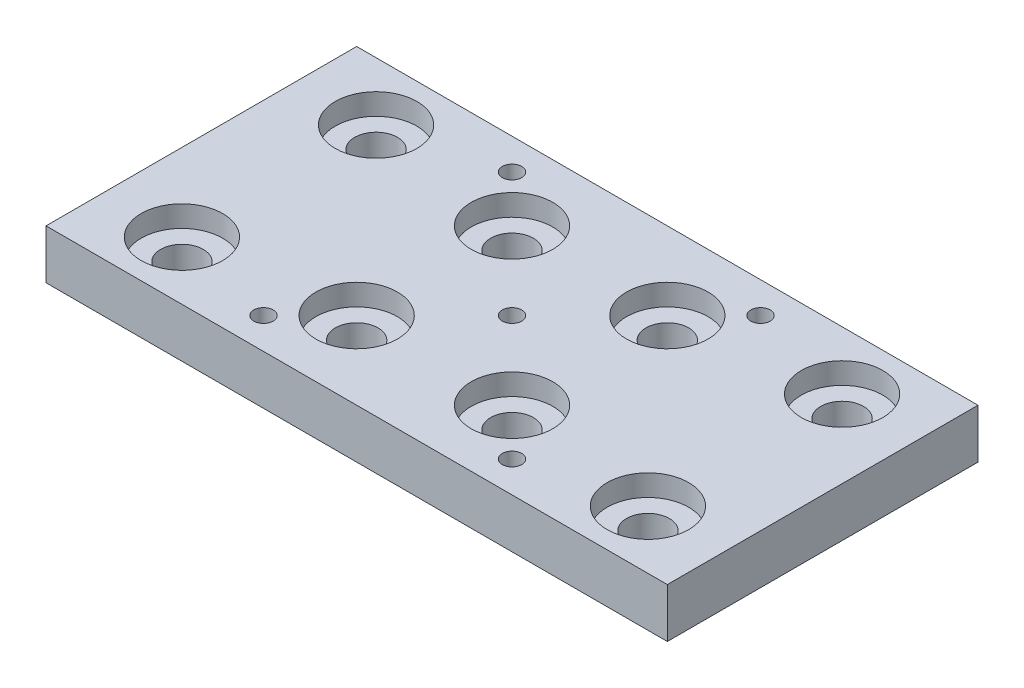
ISO-10303-21;
HEADER;
FILE_DESCRIPTION(('STEP AP214'),'2;1');
FILE_NAME('part.step','',(''),(''),'','','');
FILE_SCHEMA(('AUTOMOTIVE_DESIGN { 1 0 10303 214 1 1 1 1 }'));
ENDSEC;
DATA;
#1=APPLICATION_CONTEXT('core data for automotive mechanical design processes');
#2=APPLICATION_PROTOCOL_DEFINITION('international standard','automotive_design',2000,#1);
#3=PRODUCT_CONTEXT('',#1,'mechanical');
#4=PRODUCT('Part','Part','',(#3));
#5=PRODUCT_RELATED_PRODUCT_CATEGORY('part','',(#4));
#6=PRODUCT_DEFINITION_FORMATION('','',#4);
#7=PRODUCT_DEFINITION_CONTEXT('part definition',#1,'design');
#8=PRODUCT_DEFINITION('design','',#6,#7);
#9=PRODUCT_DEFINITION_SHAPE('','',#8);
#10=(LENGTH_UNIT() NAMED_UNIT(*) SI_UNIT(.MILLI.,.METRE.));
#11=(NAMED_UNIT(*) PLANE_ANGLE_UNIT() SI_UNIT($,.RADIAN.));
#12=(NAMED_UNIT(*) SI_UNIT($,.STERADIAN.) SOLID_ANGLE_UNIT());
#13=UNCERTAINTY_MEASURE_WITH_UNIT(LENGTH_MEASURE(1.E-05),#10,'distance_accuracy_value','');
#14=(GEOMETRIC_REPRESENTATION_CONTEXT(3) GLOBAL_UNCERTAINTY_ASSIGNED_CONTEXT((#13)) GLOBAL_UNIT_ASSIGNED_CONTEXT((#10,
#11,#12)) REPRESENTATION_CONTEXT('',''));
#15=CARTESIAN_POINT('',(0.,0.,0.));
#16=DIRECTION('',(0.,0.,1.));
#17=DIRECTION('',(1.,0.,0.));
#18=AXIS2_PLACEMENT_3D('',#15,#16,#17);
#19=CARTESIAN_POINT('',(0.,0.,0.));
#20=DIRECTION('',(0.,-1.,0.));
#21=DIRECTION('',(0.,0.,-1.));
#22=AXIS2_PLACEMENT_3D('',#19,#20,#21);
#23=PLANE('',#22);
#24=CARTESIAN_POINT('',(10.,0.,-10.));
#25=DIRECTION('',(0.,1.,0.));
#26=DIRECTION('',(0.,0.,1.));
#27=AXIS2_PLACEMENT_3D('',#24,#25,#26);
#28=CIRCLE('',#27,2.75);
#29=CARTESIAN_POINT('',(10.,0.,-7.25));
#30=VERTEX_POINT('',#29);
#31=EDGE_CURVE('E229',#30,#30,#28,.T.);
#32=ORIENTED_EDGE('',*,*,#31,.T.);
#33=EDGE_LOOP('',(#32));
#34=FACE_BOUND('',#33,.T.);
#35=CARTESIAN_POINT('',(30.,0.,-12.5));
#36=DIRECTION('',(0.,1.,0.));
#37=DIRECTION('',(0.,0.,1.));
#38=AXIS2_PLACEMENT_3D('',#35,#36,#37);
#39=CIRCLE('',#38,2.75);
#40=CARTESIAN_POINT('',(30.,0.,-9.75000000000001));
#41=VERTEX_POINT('',#40);
#42=EDGE_CURVE('E217',#41,#41,#39,.T.);
#43=ORIENTED_EDGE('',*,*,#42,.T.);
#44=EDGE_LOOP('',(#43));
#45=FACE_BOUND('',#44,.T.);
#46=CARTESIAN_POINT('',(-30.,0.,-12.5));
#47=DIRECTION('',(0.,1.,0.));
#48=DIRECTION('',(0.,0.,1.));
#49=AXIS2_PLACEMENT_3D('',#46,#47,#48);
#50=CIRCLE('',#49,2.75);
#51=CARTESIAN_POINT('',(-30.,0.,-9.74999999999998));
#52=VERTEX_POINT('',#51);
#53=EDGE_CURVE('E205',#52,#52,#50,.T.);
#54=ORIENTED_EDGE('',*,*,#53,.T.);
#55=EDGE_LOOP('',(#54));
#56=FACE_BOUND('',#55,.T.);
#57=CARTESIAN_POINT('',(-10.,0.,-10.));
#58=DIRECTION('',(0.,1.,0.));
#59=DIRECTION('',(0.,0.,1.));
#60=AXIS2_PLACEMENT_3D('',#57,#58,#59);
#61=CIRCLE('',#60,2.75);
#62=CARTESIAN_POINT('',(-10.,0.,-7.25));
#63=VERTEX_POINT('',#62);
#64=EDGE_CURVE('E193',#63,#63,#61,.T.);
#65=ORIENTED_EDGE('',*,*,#64,.T.);
#66=EDGE_LOOP('',(#65));
#67=FACE_BOUND('',#66,.T.);
#68=CARTESIAN_POINT('',(30.,0.,12.5));
#69=DIRECTION('',(0.,1.,0.));
#70=DIRECTION('',(0.,0.,1.));
#71=AXIS2_PLACEMENT_3D('',#68,#69,#70);
#72=CIRCLE('',#71,2.75);
#73=CARTESIAN_POINT('',(30.,0.,15.25));
#74=VERTEX_POINT('',#73);
#75=EDGE_CURVE('E181',#74,#74,#72,.T.);
#76=ORIENTED_EDGE('',*,*,#75,.T.);
#77=EDGE_LOOP('',(#76));
#78=FACE_BOUND('',#77,.T.);
#79=CARTESIAN_POINT('',(10.,0.,10.));
#80=DIRECTION('',(0.,1.,0.));
#81=DIRECTION('',(0.,0.,1.));
#82=AXIS2_PLACEMENT_3D('',#79,#80,#81);
#83=CIRCLE('',#82,2.75);
#84=CARTESIAN_POINT('',(10.,0.,12.75));
#85=VERTEX_POINT('',#84);
#86=EDGE_CURVE('E169',#85,#85,#83,.T.);
#87=ORIENTED_EDGE('',*,*,#86,.T.);
#88=EDGE_LOOP('',(#87));
#89=FACE_BOUND('',#88,.T.);
#90=CARTESIAN_POINT('',(-10.,0.,10.));
#91=DIRECTION('',(0.,1.,0.));
#92=DIRECTION('',(0.,0.,1.));
#93=AXIS2_PLACEMENT_3D('',#90,#91,#92);
#94=CIRCLE('',#93,2.75);
#95=CARTESIAN_POINT('',(-10.,0.,12.75));
#96=VERTEX_POINT('',#95);
#97=EDGE_CURVE('E157',#96,#96,#94,.T.);
#98=ORIENTED_EDGE('',*,*,#97,.T.);
#99=EDGE_LOOP('',(#98));
#100=FACE_BOUND('',#99,.T.);
#101=DIRECTION('',(0.,0.,-1.));
#102=VECTOR('',#101,1.);
#103=CARTESIAN_POINT('',(40.,0.,20.));
#104=LINE('',#103,#102);
#105=CARTESIAN_POINT('',(40.,0.,20.));
#106=VERTEX_POINT('',#105);
#107=CARTESIAN_POINT('',(40.,0.,-20.));
#108=VERTEX_POINT('',#107);
#109=EDGE_CURVE('E102',#106,#108,#104,.T.);
#110=ORIENTED_EDGE('',*,*,#109,.F.);
#111=DIRECTION('',(1.,0.,0.));
#112=VECTOR('',#111,1.);
#113=CARTESIAN_POINT('',(-40.,0.,20.));
#114=LINE('',#113,#112);
#115=CARTESIAN_POINT('',(-40.,0.,20.));
#116=VERTEX_POINT('',#115);
#117=EDGE_CURVE('E78',#116,#106,#114,.T.);
#118=ORIENTED_EDGE('',*,*,#117,.F.);
#119=DIRECTION('',(0.,0.,1.));
#120=VECTOR('',#119,1.);
#121=CARTESIAN_POINT('',(-40.,0.,20.));
#122=LINE('',#121,#120);
#123=CARTESIAN_POINT('',(-40.,0.,-20.));
#124=VERTEX_POINT('',#123);
#125=EDGE_CURVE('E72',#124,#116,#122,.T.);
#126=ORIENTED_EDGE('',*,*,#125,.F.);
#127=DIRECTION('',(-1.,0.,0.));
#128=VECTOR('',#127,1.);
#129=CARTESIAN_POINT('',(-40.,0.,-20.));
#130=LINE('',#129,#128);
#131=EDGE_CURVE('E94',#108,#124,#130,.T.);
#132=ORIENTED_EDGE('',*,*,#131,.F.);
#133=EDGE_LOOP('',(#110,#118,#126,#132));
#134=FACE_BOUND('',#133,.T.);
#135=CARTESIAN_POINT('',(16.,0.,16.));
#136=DIRECTION('',(0.,1.,0.));
#137=DIRECTION('',(0.,0.,1.));
#138=AXIS2_PLACEMENT_3D('',#135,#136,#137);
#139=CIRCLE('',#138,1.25);
#140=CARTESIAN_POINT('',(16.,0.,17.25));
#141=VERTEX_POINT('',#140);
#142=EDGE_CURVE('E105',#141,#141,#139,.T.);
#143=ORIENTED_EDGE('',*,*,#142,.T.);
#144=EDGE_LOOP('',(#143));
#145=FACE_BOUND('',#144,.T.);
#146=CARTESIAN_POINT('',(-16.,0.,-16.));
#147=DIRECTION('',(0.,1.,0.));
#148=DIRECTION('',(0.,0.,1.));
#149=AXIS2_PLACEMENT_3D('',#146,#147,#148);
#150=CIRCLE('',#149,1.25);
#151=CARTESIAN_POINT('',(-16.,0.,-14.75));
#152=VERTEX_POINT('',#151);
#153=EDGE_CURVE('E121',#152,#152,#150,.T.);
#154=ORIENTED_EDGE('',*,*,#153,.T.);
#155=EDGE_LOOP('',(#154));
#156=FACE_BOUND('',#155,.T.);
#157=CARTESIAN_POINT('',(-16.,0.,16.));
#158=DIRECTION('',(0.,1.,0.));
#159=DIRECTION('',(0.,0.,1.));
#160=AXIS2_PLACEMENT_3D('',#157,#158,#159);
#161=CIRCLE('',#160,1.25);
#162=CARTESIAN_POINT('',(-16.,0.,17.25));
#163=VERTEX_POINT('',#162);
#164=EDGE_CURVE('E127',#163,#163,#161,.T.);
#165=ORIENTED_EDGE('',*,*,#164,.T.);
#166=EDGE_LOOP('',(#165));
#167=FACE_BOUND('',#166,.T.);
#168=CARTESIAN_POINT('',(16.,0.,-16.));
#169=DIRECTION('',(0.,1.,0.));
#170=DIRECTION('',(0.,0.,1.));
#171=AXIS2_PLACEMENT_3D('',#168,#169,#170);
#172=CIRCLE('',#171,1.25);
#173=CARTESIAN_POINT('',(16.,0.,-14.75));
#174=VERTEX_POINT('',#173);
#175=EDGE_CURVE('E133',#174,#174,#172,.T.);
#176=ORIENTED_EDGE('',*,*,#175,.T.);
#177=EDGE_LOOP('',(#176));
#178=FACE_BOUND('',#177,.T.);
#179=CARTESIAN_POINT('',(0.,0.,0.));
#180=DIRECTION('',(0.,1.,0.));
#181=DIRECTION('',(0.,0.,1.));
#182=AXIS2_PLACEMENT_3D('',#179,#180,#181);
#183=CIRCLE('',#182,1.25);
#184=CARTESIAN_POINT('',(0.,0.,1.25));
#185=VERTEX_POINT('',#184);
#186=EDGE_CURVE('E139',#185,#185,#183,.T.);
#187=ORIENTED_EDGE('',*,*,#186,.T.);
#188=EDGE_LOOP('',(#187));
#189=FACE_BOUND('',#188,.T.);
#190=CARTESIAN_POINT('',(-30.,0.,12.5));
#191=DIRECTION('',(0.,1.,0.));
#192=DIRECTION('',(0.,0.,1.));
#193=AXIS2_PLACEMENT_3D('',#190,#191,#192);
#194=CIRCLE('',#193,2.75);
#195=CARTESIAN_POINT('',(-30.,0.,15.25));
#196=VERTEX_POINT('',#195);
#197=EDGE_CURVE('E145',#196,#196,#194,.T.);
#198=ORIENTED_EDGE('',*,*,#197,.T.);
#199=EDGE_LOOP('',(#198));
#200=FACE_BOUND('',#199,.T.);
#201=ADVANCED_FACE('F38',(#34,#45,#56,#67,#78,#89,#100,#134,#145,#156,#167,#178,#189,#200),#23,.T.);
#202=CARTESIAN_POINT('',(40.,6.35,20.));
#203=DIRECTION('',(-1.,0.,0.));
#204=DIRECTION('',(0.,0.,1.));
#205=AXIS2_PLACEMENT_3D('',#202,#203,#204);
#206=PLANE('',#205);
#207=ORIENTED_EDGE('',*,*,#109,.T.);
#208=DIRECTION('',(0.,-1.,0.));
#209=VECTOR('',#208,1.);
#210=CARTESIAN_POINT('',(40.,6.35,-20.));
#211=LINE('',#210,#209);
#212=CARTESIAN_POINT('',(40.,6.35,-20.));
#213=VERTEX_POINT('',#212);
#214=EDGE_CURVE('E11',#213,#108,#211,.T.);
#215=ORIENTED_EDGE('',*,*,#214,.F.);
#216=DIRECTION('',(0.,0.,-1.));
#217=VECTOR('',#216,1.);
#218=CARTESIAN_POINT('',(40.,6.35,20.));
#219=LINE('',#218,#217);
#220=CARTESIAN_POINT('',(40.,6.35,20.));
#221=VERTEX_POINT('',#220);
#222=EDGE_CURVE('E90',#221,#213,#219,.T.);
#223=ORIENTED_EDGE('',*,*,#222,.F.);
#224=DIRECTION('',(0.,-1.,0.));
#225=VECTOR('',#224,1.);
#226=CARTESIAN_POINT('',(40.,6.35,20.));
#227=LINE('',#226,#225);
#228=EDGE_CURVE('E98',#221,#106,#227,.T.);
#229=ORIENTED_EDGE('',*,*,#228,.T.);
#230=EDGE_LOOP('',(#207,#215,#223,#229));
#231=FACE_BOUND('',#230,.T.);
#232=ADVANCED_FACE('F40',(#231),#206,.F.);
#233=CARTESIAN_POINT('',(-40.,6.35,-20.));
#234=DIRECTION('',(0.,0.,1.));
#235=DIRECTION('',(1.,0.,0.));
#236=AXIS2_PLACEMENT_3D('',#233,#234,#235);
#237=PLANE('',#236);
#238=ORIENTED_EDGE('',*,*,#131,.T.);
#239=DIRECTION('',(0.,-1.,0.));
#240=VECTOR('',#239,1.);
#241=CARTESIAN_POINT('',(-40.,6.35,-20.));
#242=LINE('',#241,#240);
#243=CARTESIAN_POINT('',(-40.,6.35,-20.));
#244=VERTEX_POINT('',#243);
#245=EDGE_CURVE('E47',#244,#124,#242,.T.);
#246=ORIENTED_EDGE('',*,*,#245,.F.);
#247=DIRECTION('',(-1.,0.,0.));
#248=VECTOR('',#247,1.);
#249=CARTESIAN_POINT('',(-40.,6.35,-20.));
#250=LINE('',#249,#248);
#251=EDGE_CURVE('E85',#213,#244,#250,.T.);
#252=ORIENTED_EDGE('',*,*,#251,.F.);
#253=ORIENTED_EDGE('',*,*,#214,.T.);
#254=EDGE_LOOP('',(#238,#246,#252,#253));
#255=FACE_BOUND('',#254,.T.);
#256=ADVANCED_FACE('F93',(#255),#237,.F.);
#257=CARTESIAN_POINT('',(-40.,6.35,20.));
#258=DIRECTION('',(1.,0.,0.));
#259=DIRECTION('',(0.,0.,-1.));
#260=AXIS2_PLACEMENT_3D('',#257,#258,#259);
#261=PLANE('',#260);
#262=ORIENTED_EDGE('',*,*,#125,.T.);
#263=DIRECTION('',(0.,-1.,0.));
#264=VECTOR('',#263,1.);
#265=CARTESIAN_POINT('',(-40.,6.35,20.));
#266=LINE('',#265,#264);
#267=CARTESIAN_POINT('',(-40.,6.35,20.));
#268=VERTEX_POINT('',#267);
#269=EDGE_CURVE('E95',#268,#116,#266,.T.);
#270=ORIENTED_EDGE('',*,*,#269,.F.);
#271=DIRECTION('',(0.,0.,1.));
#272=VECTOR('',#271,1.);
#273=CARTESIAN_POINT('',(-40.,6.35,20.));
#274=LINE('',#273,#272);
#275=EDGE_CURVE('E88',#244,#268,#274,.T.);
#276=ORIENTED_EDGE('',*,*,#275,.F.);
#277=ORIENTED_EDGE('',*,*,#245,.T.);
#278=EDGE_LOOP('',(#262,#270,#276,#277));
#279=FACE_BOUND('',#278,.T.);
#280=ADVANCED_FACE('F96',(#279),#261,.F.);
#281=CARTESIAN_POINT('',(-40.,6.35,20.));
#282=DIRECTION('',(0.,0.,-1.));
#283=DIRECTION('',(-1.,0.,0.));
#284=AXIS2_PLACEMENT_3D('',#281,#282,#283);
#285=PLANE('',#284);
#286=ORIENTED_EDGE('',*,*,#117,.T.);
#287=ORIENTED_EDGE('',*,*,#228,.F.);
#288=DIRECTION('',(1.,0.,0.));
#289=VECTOR('',#288,1.);
#290=CARTESIAN_POINT('',(-40.,6.35,20.));
#291=LINE('',#290,#289);
#292=EDGE_CURVE('E55',#268,#221,#291,.T.);
#293=ORIENTED_EDGE('',*,*,#292,.F.);
#294=ORIENTED_EDGE('',*,*,#269,.T.);
#295=EDGE_LOOP('',(#286,#287,#293,#294));
#296=FACE_BOUND('',#295,.T.);
#297=ADVANCED_FACE('F110',(#296),#285,.F.);
#298=CARTESIAN_POINT('',(0.,6.35,0.));
#299=DIRECTION('',(0.,-1.,0.));
#300=DIRECTION('',(0.,0.,-1.));
#301=AXIS2_PLACEMENT_3D('',#298,#299,#300);
#302=PLANE('',#301);
#303=CARTESIAN_POINT('',(10.,6.35,-10.));
#304=DIRECTION('',(0.,1.,0.));
#305=DIRECTION('',(0.,0.,1.));
#306=AXIS2_PLACEMENT_3D('',#303,#304,#305);
#307=CIRCLE('',#306,5.25);
#308=CARTESIAN_POINT('',(10.,6.35,-4.75));
#309=VERTEX_POINT('',#308);
#310=EDGE_CURVE('E238',#309,#309,#307,.T.);
#311=ORIENTED_EDGE('',*,*,#310,.F.);
#312=EDGE_LOOP('',(#311));
#313=FACE_BOUND('',#312,.T.);
#314=CARTESIAN_POINT('',(30.,6.35,-12.5));
#315=DIRECTION('',(0.,1.,0.));
#316=DIRECTION('',(0.,0.,1.));
#317=AXIS2_PLACEMENT_3D('',#314,#315,#316);
#318=CIRCLE('',#317,5.25);
#319=CARTESIAN_POINT('',(30.,6.35,-7.25));
#320=VERTEX_POINT('',#319);
#321=EDGE_CURVE('E226',#320,#320,#318,.T.);
#322=ORIENTED_EDGE('',*,*,#321,.F.);
#323=EDGE_LOOP('',(#322));
#324=FACE_BOUND('',#323,.T.);
#325=CARTESIAN_POINT('',(-30.,6.35,-12.5));
#326=DIRECTION('',(0.,1.,0.));
#327=DIRECTION('',(0.,0.,1.));
#328=AXIS2_PLACEMENT_3D('',#325,#326,#327);
#329=CIRCLE('',#328,5.25);
#330=CARTESIAN_POINT('',(-30.,6.35,-7.24999999999998));
#331=VERTEX_POINT('',#330);
#332=EDGE_CURVE('E214',#331,#331,#329,.T.);
#333=ORIENTED_EDGE('',*,*,#332,.F.);
#334=EDGE_LOOP('',(#333));
#335=FACE_BOUND('',#334,.T.);
#336=CARTESIAN_POINT('',(-10.,6.35,-10.));
#337=DIRECTION('',(0.,1.,0.));
#338=DIRECTION('',(0.,0.,1.));
#339=AXIS2_PLACEMENT_3D('',#336,#337,#338);
#340=CIRCLE('',#339,5.25);
#341=CARTESIAN_POINT('',(-10.,6.35,-4.75));
#342=VERTEX_POINT('',#341);
#343=EDGE_CURVE('E202',#342,#342,#340,.T.);
#344=ORIENTED_EDGE('',*,*,#343,.F.);
#345=EDGE_LOOP('',(#344));
#346=FACE_BOUND('',#345,.T.);
#347=CARTESIAN_POINT('',(30.,6.35,12.5));
#348=DIRECTION('',(0.,1.,0.));
#349=DIRECTION('',(0.,0.,1.));
#350=AXIS2_PLACEMENT_3D('',#347,#348,#349);
#351=CIRCLE('',#350,5.25);
#352=CARTESIAN_POINT('',(30.,6.35,17.75));
#353=VERTEX_POINT('',#352);
#354=EDGE_CURVE('E190',#353,#353,#351,.T.);
#355=ORIENTED_EDGE('',*,*,#354,.F.);
#356=EDGE_LOOP('',(#355));
#357=FACE_BOUND('',#356,.T.);
#358=CARTESIAN_POINT('',(10.,6.35,10.));
#359=DIRECTION('',(0.,1.,0.));
#360=DIRECTION('',(0.,0.,1.));
#361=AXIS2_PLACEMENT_3D('',#358,#359,#360);
#362=CIRCLE('',#361,5.25);
#363=CARTESIAN_POINT('',(10.,6.35,15.25));
#364=VERTEX_POINT('',#363);
#365=EDGE_CURVE('E178',#364,#364,#362,.T.);
#366=ORIENTED_EDGE('',*,*,#365,.F.);
#367=EDGE_LOOP('',(#366));
#368=FACE_BOUND('',#367,.T.);
#369=CARTESIAN_POINT('',(-10.,6.35,10.));
#370=DIRECTION('',(0.,1.,0.));
#371=DIRECTION('',(0.,0.,1.));
#372=AXIS2_PLACEMENT_3D('',#369,#370,#371);
#373=CIRCLE('',#372,5.25);
#374=CARTESIAN_POINT('',(-10.,6.35,15.25));
#375=VERTEX_POINT('',#374);
#376=EDGE_CURVE('E166',#375,#375,#373,.T.);
#377=ORIENTED_EDGE('',*,*,#376,.F.);
#378=EDGE_LOOP('',(#377));
#379=FACE_BOUND('',#378,.T.);
#380=CARTESIAN_POINT('',(-30.,6.35,12.5));
#381=DIRECTION('',(0.,1.,0.));
#382=DIRECTION('',(0.,0.,1.));
#383=AXIS2_PLACEMENT_3D('',#380,#381,#382);
#384=CIRCLE('',#383,5.25);
#385=CARTESIAN_POINT('',(-30.,6.35,17.75));
#386=VERTEX_POINT('',#385);
#387=EDGE_CURVE('E154',#386,#386,#384,.T.);
#388=ORIENTED_EDGE('',*,*,#387,.F.);
#389=EDGE_LOOP('',(#388));
#390=FACE_BOUND('',#389,.T.);
#391=CARTESIAN_POINT('',(0.,6.35,0.));
#392=DIRECTION('',(0.,1.,0.));
#393=DIRECTION('',(0.,0.,1.));
#394=AXIS2_PLACEMENT_3D('',#391,#392,#393);
#395=CIRCLE('',#394,1.25);
#396=CARTESIAN_POINT('',(0.,6.35,1.25));
#397=VERTEX_POINT('',#396);
#398=EDGE_CURVE('E142',#397,#397,#395,.T.);
#399=ORIENTED_EDGE('',*,*,#398,.F.);
#400=EDGE_LOOP('',(#399));
#401=FACE_BOUND('',#400,.T.);
#402=CARTESIAN_POINT('',(16.,6.35,-16.));
#403=DIRECTION('',(0.,1.,0.));
#404=DIRECTION('',(0.,0.,1.));
#405=AXIS2_PLACEMENT_3D('',#402,#403,#404);
#406=CIRCLE('',#405,1.25);
#407=CARTESIAN_POINT('',(16.,6.35,-14.75));
#408=VERTEX_POINT('',#407);
#409=EDGE_CURVE('E136',#408,#408,#406,.T.);
#410=ORIENTED_EDGE('',*,*,#409,.F.);
#411=EDGE_LOOP('',(#410));
#412=FACE_BOUND('',#411,.T.);
#413=CARTESIAN_POINT('',(-16.,6.35,16.));
#414=DIRECTION('',(0.,1.,0.));
#415=DIRECTION('',(0.,0.,1.));
#416=AXIS2_PLACEMENT_3D('',#413,#414,#415);
#417=CIRCLE('',#416,1.25);
#418=CARTESIAN_POINT('',(-16.,6.35,17.25));
#419=VERTEX_POINT('',#418);
#420=EDGE_CURVE('E130',#419,#419,#417,.T.);
#421=ORIENTED_EDGE('',*,*,#420,.F.);
#422=EDGE_LOOP('',(#421));
#423=FACE_BOUND('',#422,.T.);
#424=CARTESIAN_POINT('',(-16.,6.35,-16.));
#425=DIRECTION('',(0.,1.,0.));
#426=DIRECTION('',(0.,0.,1.));
#427=AXIS2_PLACEMENT_3D('',#424,#425,#426);
#428=CIRCLE('',#427,1.25);
#429=CARTESIAN_POINT('',(-16.,6.35,-14.75));
#430=VERTEX_POINT('',#429);
#431=EDGE_CURVE('E124',#430,#430,#428,.T.);
#432=ORIENTED_EDGE('',*,*,#431,.F.);
#433=EDGE_LOOP('',(#432));
#434=FACE_BOUND('',#433,.T.);
#435=CARTESIAN_POINT('',(16.,6.35,16.));
#436=DIRECTION('',(0.,1.,0.));
#437=DIRECTION('',(0.,0.,1.));
#438=AXIS2_PLACEMENT_3D('',#435,#436,#437);
#439=CIRCLE('',#438,1.25);
#440=CARTESIAN_POINT('',(16.,6.35,17.25));
#441=VERTEX_POINT('',#440);
#442=EDGE_CURVE('E118',#441,#441,#439,.T.);
#443=ORIENTED_EDGE('',*,*,#442,.F.);
#444=EDGE_LOOP('',(#443));
#445=FACE_BOUND('',#444,.T.);
#446=ORIENTED_EDGE('',*,*,#222,.T.);
#447=ORIENTED_EDGE('',*,*,#251,.T.);
#448=ORIENTED_EDGE('',*,*,#275,.T.);
#449=ORIENTED_EDGE('',*,*,#292,.T.);
#450=EDGE_LOOP('',(#446,#447,#448,#449));
#451=FACE_BOUND('',#450,.T.);
#452=ADVANCED_FACE('F86',(#313,#324,#335,#346,#357,#368,#379,#390,#401,#412,#423,#434,#445,
#451),#302,.F.);
#453=CARTESIAN_POINT('',(16.,6.35,16.));
#454=DIRECTION('',(0.,1.,0.));
#455=DIRECTION('',(0.,0.,1.));
#456=AXIS2_PLACEMENT_3D('',#453,#454,#455);
#457=CYLINDRICAL_SURFACE('',#456,1.25);
#458=ORIENTED_EDGE('',*,*,#142,.F.);
#459=EDGE_LOOP('',(#458));
#460=FACE_BOUND('',#459,.T.);
#461=ORIENTED_EDGE('',*,*,#442,.T.);
#462=EDGE_LOOP('',(#461));
#463=FACE_BOUND('',#462,.T.);
#464=ADVANCED_FACE('F246',(#460,#463),#457,.F.);
#465=CARTESIAN_POINT('',(-16.,6.35,-16.));
#466=DIRECTION('',(0.,1.,0.));
#467=DIRECTION('',(0.,0.,1.));
#468=AXIS2_PLACEMENT_3D('',#465,#466,#467);
#469=CYLINDRICAL_SURFACE('',#468,1.25);
#470=ORIENTED_EDGE('',*,*,#153,.F.);
#471=EDGE_LOOP('',(#470));
#472=FACE_BOUND('',#471,.T.);
#473=ORIENTED_EDGE('',*,*,#431,.T.);
#474=EDGE_LOOP('',(#473));
#475=FACE_BOUND('',#474,.T.);
#476=ADVANCED_FACE('F273',(#472,#475),#469,.F.);
#477=CARTESIAN_POINT('',(-16.,6.35,16.));
#478=DIRECTION('',(0.,1.,0.));
#479=DIRECTION('',(0.,0.,1.));
#480=AXIS2_PLACEMENT_3D('',#477,#478,#479);
#481=CYLINDRICAL_SURFACE('',#480,1.25);
#482=ORIENTED_EDGE('',*,*,#164,.F.);
#483=EDGE_LOOP('',(#482));
#484=FACE_BOUND('',#483,.T.);
#485=ORIENTED_EDGE('',*,*,#420,.T.);
#486=EDGE_LOOP('',(#485));
#487=FACE_BOUND('',#486,.T.);
#488=ADVANCED_FACE('F279',(#484,#487),#481,.F.);
#489=CARTESIAN_POINT('',(16.,6.35,-16.));
#490=DIRECTION('',(0.,1.,0.));
#491=DIRECTION('',(0.,0.,1.));
#492=AXIS2_PLACEMENT_3D('',#489,#490,#491);
#493=CYLINDRICAL_SURFACE('',#492,1.25);
#494=ORIENTED_EDGE('',*,*,#175,.F.);
#495=EDGE_LOOP('',(#494));
#496=FACE_BOUND('',#495,.T.);
#497=ORIENTED_EDGE('',*,*,#409,.T.);
#498=EDGE_LOOP('',(#497));
#499=FACE_BOUND('',#498,.T.);
#500=ADVANCED_FACE('F564',(#496,#499),#493,.F.);
#501=CARTESIAN_POINT('',(0.,6.35,0.));
#502=DIRECTION('',(0.,1.,0.));
#503=DIRECTION('',(0.,0.,1.));
#504=AXIS2_PLACEMENT_3D('',#501,#502,#503);
#505=CYLINDRICAL_SURFACE('',#504,1.25);
#506=ORIENTED_EDGE('',*,*,#186,.F.);
#507=EDGE_LOOP('',(#506));
#508=FACE_BOUND('',#507,.T.);
#509=ORIENTED_EDGE('',*,*,#398,.T.);
#510=EDGE_LOOP('',(#509));
#511=FACE_BOUND('',#510,.T.);
#512=ADVANCED_FACE('F327',(#508,#511),#505,.F.);
#513=CARTESIAN_POINT('',(-30.,6.35,12.5));
#514=DIRECTION('',(0.,1.,0.));
#515=DIRECTION('',(0.,0.,1.));
#516=AXIS2_PLACEMENT_3D('',#513,#514,#515);
#517=CYLINDRICAL_SURFACE('',#516,2.75);
#518=ORIENTED_EDGE('',*,*,#197,.F.);
#519=EDGE_LOOP('',(#518));
#520=FACE_BOUND('',#519,.T.);
#521=CARTESIAN_POINT('',(-30.,3.6,12.5));
#522=DIRECTION('',(0.,1.,0.));
#523=DIRECTION('',(0.,0.,1.));
#524=AXIS2_PLACEMENT_3D('',#521,#522,#523);
#525=CIRCLE('',#524,2.75);
#526=CARTESIAN_POINT('',(-30.,3.6,15.25));
#527=VERTEX_POINT('',#526);
#528=EDGE_CURVE('E148',#527,#527,#525,.T.);
#529=ORIENTED_EDGE('',*,*,#528,.T.);
#530=EDGE_LOOP('',(#529));
#531=FACE_BOUND('',#530,.T.);
#532=ADVANCED_FACE('F321',(#520,#531),#517,.F.);
#533=CARTESIAN_POINT('',(-27.25,3.6,12.5));
#534=DIRECTION('',(0.,-1.,0.));
#535=DIRECTION('',(0.,0.,-1.));
#536=AXIS2_PLACEMENT_3D('',#533,#534,#535);
#537=PLANE('',#536);
#538=ORIENTED_EDGE('',*,*,#528,.F.);
#539=EDGE_LOOP('',(#538));
#540=FACE_BOUND('',#539,.T.);
#541=CARTESIAN_POINT('',(-30.,3.6,12.5));
#542=DIRECTION('',(0.,1.,0.));
#543=DIRECTION('',(0.,0.,1.));
#544=AXIS2_PLACEMENT_3D('',#541,#542,#543);
#545=CIRCLE('',#544,5.25);
#546=CARTESIAN_POINT('',(-30.,3.6,17.75));
#547=VERTEX_POINT('',#546);
#548=EDGE_CURVE('E151',#547,#547,#545,.T.);
#549=ORIENTED_EDGE('',*,*,#548,.T.);
#550=EDGE_LOOP('',(#549));
#551=FACE_BOUND('',#550,.T.);
#552=ADVANCED_FACE('F326',(#540,#551),#537,.F.);
#553=CARTESIAN_POINT('',(-30.,6.35,12.5));
#554=DIRECTION('',(0.,1.,0.));
#555=DIRECTION('',(0.,0.,1.));
#556=AXIS2_PLACEMENT_3D('',#553,#554,#555);
#557=CYLINDRICAL_SURFACE('',#556,5.25);
#558=ORIENTED_EDGE('',*,*,#548,.F.);
#559=EDGE_LOOP('',(#558));
#560=FACE_BOUND('',#559,.T.);
#561=ORIENTED_EDGE('',*,*,#387,.T.);
#562=EDGE_LOOP('',(#561));
#563=FACE_BOUND('',#562,.T.);
#564=ADVANCED_FACE('F338',(#560,#563),#557,.F.);
#565=CARTESIAN_POINT('',(-10.,6.35,10.));
#566=DIRECTION('',(0.,1.,0.));
#567=DIRECTION('',(0.,0.,1.));
#568=AXIS2_PLACEMENT_3D('',#565,#566,#567);
#569=CYLINDRICAL_SURFACE('',#568,2.75);
#570=ORIENTED_EDGE('',*,*,#97,.F.);
#571=EDGE_LOOP('',(#570));
#572=FACE_BOUND('',#571,.T.);
#573=CARTESIAN_POINT('',(-10.,3.6,10.));
#574=DIRECTION('',(0.,1.,0.));
#575=DIRECTION('',(0.,0.,1.));
#576=AXIS2_PLACEMENT_3D('',#573,#574,#575);
#577=CIRCLE('',#576,2.75);
#578=CARTESIAN_POINT('',(-10.,3.6,12.75));
#579=VERTEX_POINT('',#578);
#580=EDGE_CURVE('E160',#579,#579,#577,.T.);
#581=ORIENTED_EDGE('',*,*,#580,.T.);
#582=EDGE_LOOP('',(#581));
#583=FACE_BOUND('',#582,.T.);
#584=ADVANCED_FACE('F348',(#572,#583),#569,.F.);
#585=CARTESIAN_POINT('',(-7.25,3.6,10.));
#586=DIRECTION('',(0.,-1.,0.));
#587=DIRECTION('',(0.,0.,-1.));
#588=AXIS2_PLACEMENT_3D('',#585,#586,#587);
#589=PLANE('',#588);
#590=ORIENTED_EDGE('',*,*,#580,.F.);
#591=EDGE_LOOP('',(#590));
#592=FACE_BOUND('',#591,.T.);
#593=CARTESIAN_POINT('',(-10.,3.6,10.));
#594=DIRECTION('',(0.,1.,0.));
#595=DIRECTION('',(0.,0.,1.));
#596=AXIS2_PLACEMENT_3D('',#593,#594,#595);
#597=CIRCLE('',#596,5.25);
#598=CARTESIAN_POINT('',(-10.,3.6,15.25));
#599=VERTEX_POINT('',#598);
#600=EDGE_CURVE('E163',#599,#599,#597,.T.);
#601=ORIENTED_EDGE('',*,*,#600,.T.);
#602=EDGE_LOOP('',(#601));
#603=FACE_BOUND('',#602,.T.);
#604=ADVANCED_FACE('F358',(#592,#603),#589,.F.);
#605=CARTESIAN_POINT('',(-10.,6.35,10.));
#606=DIRECTION('',(0.,1.,0.));
#607=DIRECTION('',(0.,0.,1.));
#608=AXIS2_PLACEMENT_3D('',#605,#606,#607);
#609=CYLINDRICAL_SURFACE('',#608,5.25);
#610=ORIENTED_EDGE('',*,*,#600,.F.);
#611=EDGE_LOOP('',(#610));
#612=FACE_BOUND('',#611,.T.);
#613=ORIENTED_EDGE('',*,*,#376,.T.);
#614=EDGE_LOOP('',(#613));
#615=FACE_BOUND('',#614,.T.);
#616=ADVANCED_FACE('F368',(#612,#615),#609,.F.);
#617=CARTESIAN_POINT('',(10.,6.35,10.));
#618=DIRECTION('',(0.,1.,0.));
#619=DIRECTION('',(0.,0.,1.));
#620=AXIS2_PLACEMENT_3D('',#617,#618,#619);
#621=CYLINDRICAL_SURFACE('',#620,2.75);
#622=ORIENTED_EDGE('',*,*,#86,.F.);
#623=EDGE_LOOP('',(#622));
#624=FACE_BOUND('',#623,.T.);
#625=CARTESIAN_POINT('',(10.,3.6,10.));
#626=DIRECTION('',(0.,1.,0.));
#627=DIRECTION('',(0.,0.,1.));
#628=AXIS2_PLACEMENT_3D('',#625,#626,#627);
#629=CIRCLE('',#628,2.75);
#630=CARTESIAN_POINT('',(10.,3.6,12.75));
#631=VERTEX_POINT('',#630);
#632=EDGE_CURVE('E172',#631,#631,#629,.T.);
#633=ORIENTED_EDGE('',*,*,#632,.T.);
#634=EDGE_LOOP('',(#633));
#635=FACE_BOUND('',#634,.T.);
#636=ADVANCED_FACE('F378',(#624,#635),#621,.F.);
#637=CARTESIAN_POINT('',(12.75,3.6,10.));
#638=DIRECTION('',(0.,-1.,0.));
#639=DIRECTION('',(0.,0.,-1.));
#640=AXIS2_PLACEMENT_3D('',#637,#638,#639);
#641=PLANE('',#640);
#642=ORIENTED_EDGE('',*,*,#632,.F.);
#643=EDGE_LOOP('',(#642));
#644=FACE_BOUND('',#643,.T.);
#645=CARTESIAN_POINT('',(10.,3.6,10.));
#646=DIRECTION('',(0.,1.,0.));
#647=DIRECTION('',(0.,0.,1.));
#648=AXIS2_PLACEMENT_3D('',#645,#646,#647);
#649=CIRCLE('',#648,5.25);
#650=CARTESIAN_POINT('',(10.,3.6,15.25));
#651=VERTEX_POINT('',#650);
#652=EDGE_CURVE('E175',#651,#651,#649,.T.);
#653=ORIENTED_EDGE('',*,*,#652,.T.);
#654=EDGE_LOOP('',(#653));
#655=FACE_BOUND('',#654,.T.);
#656=ADVANCED_FACE('F388',(#644,#655),#641,.F.);
#657=CARTESIAN_POINT('',(10.,6.35,10.));
#658=DIRECTION('',(0.,1.,0.));
#659=DIRECTION('',(0.,0.,1.));
#660=AXIS2_PLACEMENT_3D('',#657,#658,#659);
#661=CYLINDRICAL_SURFACE('',#660,5.25);
#662=ORIENTED_EDGE('',*,*,#652,.F.);
#663=EDGE_LOOP('',(#662));
#664=FACE_BOUND('',#663,.T.);
#665=ORIENTED_EDGE('',*,*,#365,.T.);
#666=EDGE_LOOP('',(#665));
#667=FACE_BOUND('',#666,.T.);
#668=ADVANCED_FACE('F398',(#664,#667),#661,.F.);
#669=CARTESIAN_POINT('',(30.,6.35,12.5));
#670=DIRECTION('',(0.,1.,0.));
#671=DIRECTION('',(0.,0.,1.));
#672=AXIS2_PLACEMENT_3D('',#669,#670,#671);
#673=CYLINDRICAL_SURFACE('',#672,2.75);
#674=ORIENTED_EDGE('',*,*,#75,.F.);
#675=EDGE_LOOP('',(#674));
#676=FACE_BOUND('',#675,.T.);
#677=CARTESIAN_POINT('',(30.,3.6,12.5));
#678=DIRECTION('',(0.,1.,0.));
#679=DIRECTION('',(0.,0.,1.));
#680=AXIS2_PLACEMENT_3D('',#677,#678,#679);
#681=CIRCLE('',#680,2.75);
#682=CARTESIAN_POINT('',(30.,3.6,15.25));
#683=VERTEX_POINT('',#682);
#684=EDGE_CURVE('E184',#683,#683,#681,.T.);
#685=ORIENTED_EDGE('',*,*,#684,.T.);
#686=EDGE_LOOP('',(#685));
#687=FACE_BOUND('',#686,.T.);
#688=ADVANCED_FACE('F408',(#676,#687),#673,.F.);
#689=CARTESIAN_POINT('',(32.75,3.6,12.5));
#690=DIRECTION('',(0.,-1.,0.));
#691=DIRECTION('',(0.,0.,-1.));
#692=AXIS2_PLACEMENT_3D('',#689,#690,#691);
#693=PLANE('',#692);
#694=ORIENTED_EDGE('',*,*,#684,.F.);
#695=EDGE_LOOP('',(#694));
#696=FACE_BOUND('',#695,.T.);
#697=CARTESIAN_POINT('',(30.,3.6,12.5));
#698=DIRECTION('',(0.,1.,0.));
#699=DIRECTION('',(0.,0.,1.));
#700=AXIS2_PLACEMENT_3D('',#697,#698,#699);
#701=CIRCLE('',#700,5.25);
#702=CARTESIAN_POINT('',(30.,3.6,17.75));
#703=VERTEX_POINT('',#702);
#704=EDGE_CURVE('E187',#703,#703,#701,.T.);
#705=ORIENTED_EDGE('',*,*,#704,.T.);
#706=EDGE_LOOP('',(#705));
#707=FACE_BOUND('',#706,.T.);
#708=ADVANCED_FACE('F418',(#696,#707),#693,.F.);
#709=CARTESIAN_POINT('',(30.,6.35,12.5));
#710=DIRECTION('',(0.,1.,0.));
#711=DIRECTION('',(0.,0.,1.));
#712=AXIS2_PLACEMENT_3D('',#709,#710,#711);
#713=CYLINDRICAL_SURFACE('',#712,5.25);
#714=ORIENTED_EDGE('',*,*,#704,.F.);
#715=EDGE_LOOP('',(#714));
#716=FACE_BOUND('',#715,.T.);
#717=ORIENTED_EDGE('',*,*,#354,.T.);
#718=EDGE_LOOP('',(#717));
#719=FACE_BOUND('',#718,.T.);
#720=ADVANCED_FACE('F428',(#716,#719),#713,.F.);
#721=CARTESIAN_POINT('',(-10.,6.35,-10.));
#722=DIRECTION('',(0.,1.,0.));
#723=DIRECTION('',(0.,0.,1.));
#724=AXIS2_PLACEMENT_3D('',#721,#722,#723);
#725=CYLINDRICAL_SURFACE('',#724,2.75);
#726=ORIENTED_EDGE('',*,*,#64,.F.);
#727=EDGE_LOOP('',(#726));
#728=FACE_BOUND('',#727,.T.);
#729=CARTESIAN_POINT('',(-10.,3.6,-10.));
#730=DIRECTION('',(0.,1.,0.));
#731=DIRECTION('',(0.,0.,1.));
#732=AXIS2_PLACEMENT_3D('',#729,#730,#731);
#733=CIRCLE('',#732,2.75);
#734=CARTESIAN_POINT('',(-10.,3.6,-7.25));
#735=VERTEX_POINT('',#734);
#736=EDGE_CURVE('E196',#735,#735,#733,.T.);
#737=ORIENTED_EDGE('',*,*,#736,.T.);
#738=EDGE_LOOP('',(#737));
#739=FACE_BOUND('',#738,.T.);
#740=ADVANCED_FACE('F438',(#728,#739),#725,.F.);
#741=CARTESIAN_POINT('',(-7.25,3.6,-10.));
#742=DIRECTION('',(0.,-1.,0.));
#743=DIRECTION('',(0.,0.,-1.));
#744=AXIS2_PLACEMENT_3D('',#741,#742,#743);
#745=PLANE('',#744);
#746=ORIENTED_EDGE('',*,*,#736,.F.);
#747=EDGE_LOOP('',(#746));
#748=FACE_BOUND('',#747,.T.);
#749=CARTESIAN_POINT('',(-10.,3.6,-10.));
#750=DIRECTION('',(0.,1.,0.));
#751=DIRECTION('',(0.,0.,1.));
#752=AXIS2_PLACEMENT_3D('',#749,#750,#751);
#753=CIRCLE('',#752,5.25);
#754=CARTESIAN_POINT('',(-10.,3.6,-4.75));
#755=VERTEX_POINT('',#754);
#756=EDGE_CURVE('E199',#755,#755,#753,.T.);
#757=ORIENTED_EDGE('',*,*,#756,.T.);
#758=EDGE_LOOP('',(#757));
#759=FACE_BOUND('',#758,.T.);
#760=ADVANCED_FACE('F448',(#748,#759),#745,.F.);
#761=CARTESIAN_POINT('',(-10.,6.35,-10.));
#762=DIRECTION('',(0.,1.,0.));
#763=DIRECTION('',(0.,0.,1.));
#764=AXIS2_PLACEMENT_3D('',#761,#762,#763);
#765=CYLINDRICAL_SURFACE('',#764,5.25);
#766=ORIENTED_EDGE('',*,*,#756,.F.);
#767=EDGE_LOOP('',(#766));
#768=FACE_BOUND('',#767,.T.);
#769=ORIENTED_EDGE('',*,*,#343,.T.);
#770=EDGE_LOOP('',(#769));
#771=FACE_BOUND('',#770,.T.);
#772=ADVANCED_FACE('F458',(#768,#771),#765,.F.);
#773=CARTESIAN_POINT('',(-30.,6.35,-12.5));
#774=DIRECTION('',(0.,1.,0.));
#775=DIRECTION('',(0.,0.,1.));
#776=AXIS2_PLACEMENT_3D('',#773,#774,#775);
#777=CYLINDRICAL_SURFACE('',#776,2.75);
#778=ORIENTED_EDGE('',*,*,#53,.F.);
#779=EDGE_LOOP('',(#778));
#780=FACE_BOUND('',#779,.T.);
#781=CARTESIAN_POINT('',(-30.,3.6,-12.5));
#782=DIRECTION('',(0.,1.,0.));
#783=DIRECTION('',(0.,0.,1.));
#784=AXIS2_PLACEMENT_3D('',#781,#782,#783);
#785=CIRCLE('',#784,2.75);
#786=CARTESIAN_POINT('',(-30.,3.6,-9.74999999999998));
#787=VERTEX_POINT('',#786);
#788=EDGE_CURVE('E208',#787,#787,#785,.T.);
#789=ORIENTED_EDGE('',*,*,#788,.T.);
#790=EDGE_LOOP('',(#789));
#791=FACE_BOUND('',#790,.T.);
#792=ADVANCED_FACE('F468',(#780,#791),#777,.F.);
#793=CARTESIAN_POINT('',(-27.25,3.6,-12.5));
#794=DIRECTION('',(0.,-1.,0.));
#795=DIRECTION('',(0.,0.,-1.));
#796=AXIS2_PLACEMENT_3D('',#793,#794,#795);
#797=PLANE('',#796);
#798=ORIENTED_EDGE('',*,*,#788,.F.);
#799=EDGE_LOOP('',(#798));
#800=FACE_BOUND('',#799,.T.);
#801=CARTESIAN_POINT('',(-30.,3.6,-12.5));
#802=DIRECTION('',(0.,1.,0.));
#803=DIRECTION('',(0.,0.,1.));
#804=AXIS2_PLACEMENT_3D('',#801,#802,#803);
#805=CIRCLE('',#804,5.25);
#806=CARTESIAN_POINT('',(-30.,3.6,-7.24999999999998));
#807=VERTEX_POINT('',#806);
#808=EDGE_CURVE('E211',#807,#807,#805,.T.);
#809=ORIENTED_EDGE('',*,*,#808,.T.);
#810=EDGE_LOOP('',(#809));
#811=FACE_BOUND('',#810,.T.);
#812=ADVANCED_FACE('F478',(#800,#811),#797,.F.);
#813=CARTESIAN_POINT('',(-30.,6.35,-12.5));
#814=DIRECTION('',(0.,1.,0.));
#815=DIRECTION('',(0.,0.,1.));
#816=AXIS2_PLACEMENT_3D('',#813,#814,#815);
#817=CYLINDRICAL_SURFACE('',#816,5.25);
#818=ORIENTED_EDGE('',*,*,#808,.F.);
#819=EDGE_LOOP('',(#818));
#820=FACE_BOUND('',#819,.T.);
#821=ORIENTED_EDGE('',*,*,#332,.T.);
#822=EDGE_LOOP('',(#821));
#823=FACE_BOUND('',#822,.T.);
#824=ADVANCED_FACE('F488',(#820,#823),#817,.F.);
#825=CARTESIAN_POINT('',(30.,6.35,-12.5));
#826=DIRECTION('',(0.,1.,0.));
#827=DIRECTION('',(0.,0.,1.));
#828=AXIS2_PLACEMENT_3D('',#825,#826,#827);
#829=CYLINDRICAL_SURFACE('',#828,2.75);
#830=ORIENTED_EDGE('',*,*,#42,.F.);
#831=EDGE_LOOP('',(#830));
#832=FACE_BOUND('',#831,.T.);
#833=CARTESIAN_POINT('',(30.,3.6,-12.5));
#834=DIRECTION('',(0.,1.,0.));
#835=DIRECTION('',(0.,0.,1.));
#836=AXIS2_PLACEMENT_3D('',#833,#834,#835);
#837=CIRCLE('',#836,2.75);
#838=CARTESIAN_POINT('',(30.,3.6,-9.75));
#839=VERTEX_POINT('',#838);
#840=EDGE_CURVE('E220',#839,#839,#837,.T.);
#841=ORIENTED_EDGE('',*,*,#840,.T.);
#842=EDGE_LOOP('',(#841));
#843=FACE_BOUND('',#842,.T.);
#844=ADVANCED_FACE('F498',(#832,#843),#829,.F.);
#845=CARTESIAN_POINT('',(32.75,3.6,-12.5));
#846=DIRECTION('',(0.,-1.,0.));
#847=DIRECTION('',(0.,0.,-1.));
#848=AXIS2_PLACEMENT_3D('',#845,#846,#847);
#849=PLANE('',#848);
#850=ORIENTED_EDGE('',*,*,#840,.F.);
#851=EDGE_LOOP('',(#850));
#852=FACE_BOUND('',#851,.T.);
#853=CARTESIAN_POINT('',(30.,3.6,-12.5));
#854=DIRECTION('',(0.,1.,0.));
#855=DIRECTION('',(0.,0.,1.));
#856=AXIS2_PLACEMENT_3D('',#853,#854,#855);
#857=CIRCLE('',#856,5.25);
#858=CARTESIAN_POINT('',(30.,3.6,-7.25));
#859=VERTEX_POINT('',#858);
#860=EDGE_CURVE('E223',#859,#859,#857,.T.);
#861=ORIENTED_EDGE('',*,*,#860,.T.);
#862=EDGE_LOOP('',(#861));
#863=FACE_BOUND('',#862,.T.);
#864=ADVANCED_FACE('F508',(#852,#863),#849,.F.);
#865=CARTESIAN_POINT('',(30.,6.35,-12.5));
#866=DIRECTION('',(0.,1.,0.));
#867=DIRECTION('',(0.,0.,1.));
#868=AXIS2_PLACEMENT_3D('',#865,#866,#867);
#869=CYLINDRICAL_SURFACE('',#868,5.25);
#870=ORIENTED_EDGE('',*,*,#860,.F.);
#871=EDGE_LOOP('',(#870));
#872=FACE_BOUND('',#871,.T.);
#873=ORIENTED_EDGE('',*,*,#321,.T.);
#874=EDGE_LOOP('',(#873));
#875=FACE_BOUND('',#874,.T.);
#876=ADVANCED_FACE('F518',(#872,#875),#869,.F.);
#877=CARTESIAN_POINT('',(10.,6.35,-10.));
#878=DIRECTION('',(0.,1.,0.));
#879=DIRECTION('',(0.,0.,1.));
#880=AXIS2_PLACEMENT_3D('',#877,#878,#879);
#881=CYLINDRICAL_SURFACE('',#880,2.75);
#882=ORIENTED_EDGE('',*,*,#31,.F.);
#883=EDGE_LOOP('',(#882));
#884=FACE_BOUND('',#883,.T.);
#885=CARTESIAN_POINT('',(10.,3.6,-10.));
#886=DIRECTION('',(0.,1.,0.));
#887=DIRECTION('',(0.,0.,1.));
#888=AXIS2_PLACEMENT_3D('',#885,#886,#887);
#889=CIRCLE('',#888,2.75);
#890=CARTESIAN_POINT('',(10.,3.6,-7.25));
#891=VERTEX_POINT('',#890);
#892=EDGE_CURVE('E232',#891,#891,#889,.T.);
#893=ORIENTED_EDGE('',*,*,#892,.T.);
#894=EDGE_LOOP('',(#893));
#895=FACE_BOUND('',#894,.T.);
#896=ADVANCED_FACE('F528',(#884,#895),#881,.F.);
#897=CARTESIAN_POINT('',(12.75,3.6,-10.));
#898=DIRECTION('',(0.,-1.,0.));
#899=DIRECTION('',(0.,0.,-1.));
#900=AXIS2_PLACEMENT_3D('',#897,#898,#899);
#901=PLANE('',#900);
#902=ORIENTED_EDGE('',*,*,#892,.F.);
#903=EDGE_LOOP('',(#902));
#904=FACE_BOUND('',#903,.T.);
#905=CARTESIAN_POINT('',(10.,3.6,-10.));
#906=DIRECTION('',(0.,1.,0.));
#907=DIRECTION('',(0.,0.,1.));
#908=AXIS2_PLACEMENT_3D('',#905,#906,#907);
#909=CIRCLE('',#908,5.25);
#910=CARTESIAN_POINT('',(10.,3.6,-4.75));
#911=VERTEX_POINT('',#910);
#912=EDGE_CURVE('E235',#911,#911,#909,.T.);
#913=ORIENTED_EDGE('',*,*,#912,.T.);
#914=EDGE_LOOP('',(#913));
#915=FACE_BOUND('',#914,.T.);
#916=ADVANCED_FACE('F538',(#904,#915),#901,.F.);
#917=CARTESIAN_POINT('',(10.,6.35,-10.));
#918=DIRECTION('',(0.,1.,0.));
#919=DIRECTION('',(0.,0.,1.));
#920=AXIS2_PLACEMENT_3D('',#917,#918,#919);
#921=CYLINDRICAL_SURFACE('',#920,5.25);
#922=ORIENTED_EDGE('',*,*,#912,.F.);
#923=EDGE_LOOP('',(#922));
#924=FACE_BOUND('',#923,.T.);
#925=ORIENTED_EDGE('',*,*,#310,.T.);
#926=EDGE_LOOP('',(#925));
#927=FACE_BOUND('',#926,.T.);
#928=ADVANCED_FACE('F242',(#924,#927),#921,.F.);
#929=CLOSED_SHELL('',(#201,#232,#256,#280,#297,#452,#464,#476,#488,#500,#512,#532,#552,#564,
#584,#604,#616,#636,#656,#668,#688,#708,#720,#740,#760,#772,#792,#812,#824,#844,#864,#876,#896,
#916,#928));
#930=MANIFOLD_SOLID_BREP('B2',#929);
#931=ADVANCED_BREP_SHAPE_REPRESENTATION('',(#18,#930),#14);
#932=SHAPE_DEFINITION_REPRESENTATION(#9,#931);
ENDSEC;
END-ISO-10303-21;
